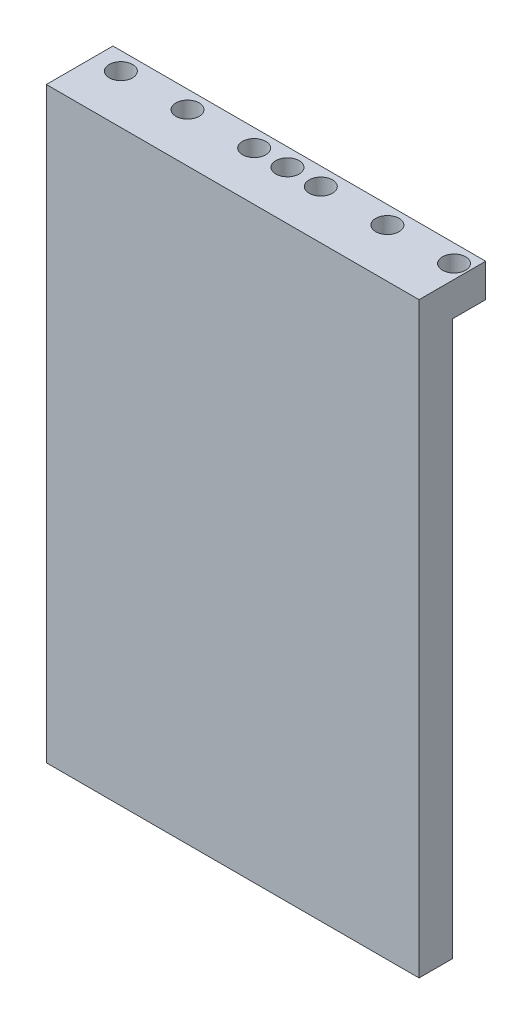
ISO-10303-21;
HEADER;
FILE_DESCRIPTION(('STEP AP214'),'2;1');
FILE_NAME('part.step','',(''),(''),'','','');
FILE_SCHEMA(('AUTOMOTIVE_DESIGN { 1 0 10303 214 1 1 1 1 }'));
ENDSEC;
DATA;
#1=APPLICATION_CONTEXT('core data for automotive mechanical design processes');
#2=APPLICATION_PROTOCOL_DEFINITION('international standard','automotive_design',2000,#1);
#3=PRODUCT_CONTEXT('',#1,'mechanical');
#4=PRODUCT('Part','Part','',(#3));
#5=PRODUCT_RELATED_PRODUCT_CATEGORY('part','',(#4));
#6=PRODUCT_DEFINITION_FORMATION('','',#4);
#7=PRODUCT_DEFINITION_CONTEXT('part definition',#1,'design');
#8=PRODUCT_DEFINITION('design','',#6,#7);
#9=PRODUCT_DEFINITION_SHAPE('','',#8);
#10=(LENGTH_UNIT() NAMED_UNIT(*) SI_UNIT(.MILLI.,.METRE.));
#11=(NAMED_UNIT(*) PLANE_ANGLE_UNIT() SI_UNIT($,.RADIAN.));
#12=(NAMED_UNIT(*) SI_UNIT($,.STERADIAN.) SOLID_ANGLE_UNIT());
#13=UNCERTAINTY_MEASURE_WITH_UNIT(LENGTH_MEASURE(1.E-05),#10,'distance_accuracy_value','');
#14=(GEOMETRIC_REPRESENTATION_CONTEXT(3) GLOBAL_UNCERTAINTY_ASSIGNED_CONTEXT((#13)) GLOBAL_UNIT_ASSIGNED_CONTEXT((#10,
#11,#12)) REPRESENTATION_CONTEXT('',''));
#15=CARTESIAN_POINT('',(0.,0.,0.));
#16=DIRECTION('',(0.,0.,1.));
#17=DIRECTION('',(1.,0.,0.));
#18=AXIS2_PLACEMENT_3D('',#15,#16,#17);
#19=CARTESIAN_POINT('',(0.,0.,0.));
#20=DIRECTION('',(0.,0.,-1.));
#21=DIRECTION('',(-1.,0.,0.));
#22=AXIS2_PLACEMENT_3D('',#19,#20,#21);
#23=PLANE('',#22);
#24=DIRECTION('',(0.,-1.,0.));
#25=VECTOR('',#24,1.);
#26=CARTESIAN_POINT('',(-55.9365891687745,-88.1594123557742,0.));
#27=LINE('',#26,#25);
#28=CARTESIAN_POINT('',(-55.9365891687745,78.1594123557742,0.));
#29=VERTEX_POINT('',#28);
#30=CARTESIAN_POINT('',(-55.9365891687745,-88.1594123557742,0.));
#31=VERTEX_POINT('',#30);
#32=EDGE_CURVE('E143',#29,#31,#27,.T.);
#33=ORIENTED_EDGE('',*,*,#32,.F.);
#34=DIRECTION('',(1.,0.,0.));
#35=VECTOR('',#34,1.);
#36=CARTESIAN_POINT('',(55.9365891687745,78.1594123557742,0.));
#37=LINE('',#36,#35);
#38=CARTESIAN_POINT('',(55.9365891687745,78.1594123557742,0.));
#39=VERTEX_POINT('',#38);
#40=EDGE_CURVE('E124',#29,#39,#37,.T.);
#41=ORIENTED_EDGE('',*,*,#40,.T.);
#42=DIRECTION('',(0.,1.,0.));
#43=VECTOR('',#42,1.);
#44=CARTESIAN_POINT('',(55.9365891687745,-88.1594123557742,0.));
#45=LINE('',#44,#43);
#46=CARTESIAN_POINT('',(55.9365891687745,-88.1594123557742,0.));
#47=VERTEX_POINT('',#46);
#48=EDGE_CURVE('E133',#47,#39,#45,.T.);
#49=ORIENTED_EDGE('',*,*,#48,.F.);
#50=DIRECTION('',(1.,0.,0.));
#51=VECTOR('',#50,1.);
#52=CARTESIAN_POINT('',(55.9365891687745,-88.1594123557742,0.));
#53=LINE('',#52,#51);
#54=EDGE_CURVE('E91',#31,#47,#53,.T.);
#55=ORIENTED_EDGE('',*,*,#54,.F.);
#56=EDGE_LOOP('',(#33,#41,#49,#55));
#57=FACE_BOUND('',#56,.T.);
#58=ADVANCED_FACE('F51',(#57),#23,.T.);
#59=CARTESIAN_POINT('',(55.9365891687745,88.1594123557742,10.));
#60=DIRECTION('',(0.,-1.,0.));
#61=DIRECTION('',(0.,0.,-1.));
#62=AXIS2_PLACEMENT_3D('',#59,#60,#61);
#63=PLANE('',#62);
#64=CARTESIAN_POINT('',(-48.2086840980566,88.1594123557742,-4.65446680339831));
#65=DIRECTION('',(0.,1.,0.));
#66=DIRECTION('',(0.,0.,1.));
#67=AXIS2_PLACEMENT_3D('',#64,#65,#66);
#68=CIRCLE('',#67,3.5);
#69=CARTESIAN_POINT('',(-48.2086840980566,88.1594123557742,-1.15446680339831));
#70=VERTEX_POINT('',#69);
#71=EDGE_CURVE('E315',#70,#70,#68,.T.);
#72=ORIENTED_EDGE('',*,*,#71,.F.);
#73=EDGE_LOOP('',(#72));
#74=FACE_BOUND('',#73,.T.);
#75=CARTESIAN_POINT('',(51.7913159019434,88.1594123557742,-4.65446680339817));
#76=DIRECTION('',(0.,1.,0.));
#77=DIRECTION('',(0.,0.,1.));
#78=AXIS2_PLACEMENT_3D('',#75,#76,#77);
#79=CIRCLE('',#78,3.5);
#80=CARTESIAN_POINT('',(51.7913159019434,88.1594123557742,-1.15446680339817));
#81=VERTEX_POINT('',#80);
#82=EDGE_CURVE('E316',#81,#81,#79,.T.);
#83=ORIENTED_EDGE('',*,*,#82,.F.);
#84=EDGE_LOOP('',(#83));
#85=FACE_BOUND('',#84,.T.);
#86=CARTESIAN_POINT('',(31.7913159019434,88.1594123557742,-4.65446680339817));
#87=DIRECTION('',(0.,1.,0.));
#88=DIRECTION('',(0.,0.,1.));
#89=AXIS2_PLACEMENT_3D('',#86,#87,#88);
#90=CIRCLE('',#89,3.5);
#91=CARTESIAN_POINT('',(31.7913159019434,88.1594123557742,-1.15446680339817));
#92=VERTEX_POINT('',#91);
#93=EDGE_CURVE('E329',#92,#92,#90,.T.);
#94=ORIENTED_EDGE('',*,*,#93,.F.);
#95=EDGE_LOOP('',(#94));
#96=FACE_BOUND('',#95,.T.);
#97=CARTESIAN_POINT('',(-28.2086840980566,88.1594123557742,-4.65446680339831));
#98=DIRECTION('',(0.,1.,0.));
#99=DIRECTION('',(0.,0.,1.));
#100=AXIS2_PLACEMENT_3D('',#97,#98,#99);
#101=CIRCLE('',#100,3.5);
#102=CARTESIAN_POINT('',(-28.2086840980566,88.1594123557742,-1.15446680339831));
#103=VERTEX_POINT('',#102);
#104=EDGE_CURVE('E332',#103,#103,#101,.T.);
#105=ORIENTED_EDGE('',*,*,#104,.F.);
#106=EDGE_LOOP('',(#105));
#107=FACE_BOUND('',#106,.T.);
#108=CARTESIAN_POINT('',(11.7913159019434,88.1594123557742,-4.65446680339817));
#109=DIRECTION('',(0.,-1.,0.));
#110=DIRECTION('',(0.,0.,-1.));
#111=AXIS2_PLACEMENT_3D('',#108,#109,#110);
#112=CIRCLE('',#111,3.5);
#113=CARTESIAN_POINT('',(11.7913159019434,88.1594123557742,-8.15446680339817));
#114=VERTEX_POINT('',#113);
#115=EDGE_CURVE('E135',#114,#114,#112,.T.);
#116=ORIENTED_EDGE('',*,*,#115,.T.);
#117=EDGE_LOOP('',(#116));
#118=FACE_BOUND('',#117,.T.);
#119=CARTESIAN_POINT('',(1.79131590194342,88.1594123557742,-4.65446680339824));
#120=DIRECTION('',(0.,-1.,0.));
#121=DIRECTION('',(0.,0.,-1.));
#122=AXIS2_PLACEMENT_3D('',#119,#120,#121);
#123=CIRCLE('',#122,3.5);
#124=CARTESIAN_POINT('',(1.79131590194342,88.1594123557742,-8.15446680339824));
#125=VERTEX_POINT('',#124);
#126=EDGE_CURVE('E345',#125,#125,#123,.T.);
#127=ORIENTED_EDGE('',*,*,#126,.T.);
#128=EDGE_LOOP('',(#127));
#129=FACE_BOUND('',#128,.T.);
#130=CARTESIAN_POINT('',(-8.20868409805658,88.1594123557742,-4.65446680339831));
#131=DIRECTION('',(0.,-1.,0.));
#132=DIRECTION('',(0.,0.,-1.));
#133=AXIS2_PLACEMENT_3D('',#130,#131,#132);
#134=CIRCLE('',#133,3.5);
#135=CARTESIAN_POINT('',(-8.20868409805658,88.1594123557742,-8.15446680339831));
#136=VERTEX_POINT('',#135);
#137=EDGE_CURVE('E138',#136,#136,#134,.T.);
#138=ORIENTED_EDGE('',*,*,#137,.T.);
#139=EDGE_LOOP('',(#138));
#140=FACE_BOUND('',#139,.T.);
#141=DIRECTION('',(0.,0.,-1.));
#142=VECTOR('',#141,1.);
#143=CARTESIAN_POINT('',(55.9365891687745,88.1594123557742,10.));
#144=LINE('',#143,#142);
#145=CARTESIAN_POINT('',(55.9365891687745,88.1594123557742,10.));
#146=VERTEX_POINT('',#145);
#147=CARTESIAN_POINT('',(55.9365891687745,88.1594123557742,-10.));
#148=VERTEX_POINT('',#147);
#149=EDGE_CURVE('E151',#146,#148,#144,.T.);
#150=ORIENTED_EDGE('',*,*,#149,.T.);
#151=DIRECTION('',(-1.,0.,0.));
#152=VECTOR('',#151,1.);
#153=CARTESIAN_POINT('',(55.9365891687745,88.1594123557742,-10.));
#154=LINE('',#153,#152);
#155=CARTESIAN_POINT('',(-55.9365891687745,88.1594123557742,-10.));
#156=VERTEX_POINT('',#155);
#157=EDGE_CURVE('E121',#148,#156,#154,.T.);
#158=ORIENTED_EDGE('',*,*,#157,.T.);
#159=DIRECTION('',(0.,0.,-1.));
#160=VECTOR('',#159,1.);
#161=CARTESIAN_POINT('',(-55.9365891687745,88.1594123557742,10.));
#162=LINE('',#161,#160);
#163=CARTESIAN_POINT('',(-55.9365891687745,88.1594123557742,10.));
#164=VERTEX_POINT('',#163);
#165=EDGE_CURVE('E13',#164,#156,#162,.T.);
#166=ORIENTED_EDGE('',*,*,#165,.F.);
#167=DIRECTION('',(-1.,0.,0.));
#168=VECTOR('',#167,1.);
#169=CARTESIAN_POINT('',(55.9365891687745,88.1594123557742,10.));
#170=LINE('',#169,#168);
#171=EDGE_CURVE('E145',#146,#164,#170,.T.);
#172=ORIENTED_EDGE('',*,*,#171,.F.);
#173=EDGE_LOOP('',(#150,#158,#166,#172));
#174=FACE_BOUND('',#173,.T.);
#175=ADVANCED_FACE('F53',(#74,#85,#96,#107,#118,#129,#140,#174),#63,.F.);
#176=CARTESIAN_POINT('',(-55.9365891687745,-88.1594123557742,10.));
#177=DIRECTION('',(1.,0.,0.));
#178=DIRECTION('',(0.,0.,-1.));
#179=AXIS2_PLACEMENT_3D('',#176,#177,#178);
#180=PLANE('',#179);
#181=ORIENTED_EDGE('',*,*,#165,.T.);
#182=DIRECTION('',(0.,1.,0.));
#183=VECTOR('',#182,1.);
#184=CARTESIAN_POINT('',(-55.9365891687745,78.1594123557742,-10.));
#185=LINE('',#184,#183);
#186=CARTESIAN_POINT('',(-55.9365891687745,78.1594123557742,-10.));
#187=VERTEX_POINT('',#186);
#188=EDGE_CURVE('E123',#187,#156,#185,.T.);
#189=ORIENTED_EDGE('',*,*,#188,.F.);
#190=DIRECTION('',(0.,0.,1.));
#191=VECTOR('',#190,1.);
#192=CARTESIAN_POINT('',(-55.9365891687745,78.1594123557742,-10.));
#193=LINE('',#192,#191);
#194=EDGE_CURVE('E128',#187,#29,#193,.T.);
#195=ORIENTED_EDGE('',*,*,#194,.T.);
#196=ORIENTED_EDGE('',*,*,#32,.T.);
#197=DIRECTION('',(0.,0.,-1.));
#198=VECTOR('',#197,1.);
#199=CARTESIAN_POINT('',(-55.9365891687745,-88.1594123557742,10.));
#200=LINE('',#199,#198);
#201=CARTESIAN_POINT('',(-55.9365891687745,-88.1594123557742,10.));
#202=VERTEX_POINT('',#201);
#203=EDGE_CURVE('E59',#202,#31,#200,.T.);
#204=ORIENTED_EDGE('',*,*,#203,.F.);
#205=DIRECTION('',(0.,-1.,0.));
#206=VECTOR('',#205,1.);
#207=CARTESIAN_POINT('',(-55.9365891687745,-88.1594123557742,10.));
#208=LINE('',#207,#206);
#209=EDGE_CURVE('E98',#164,#202,#208,.T.);
#210=ORIENTED_EDGE('',*,*,#209,.F.);
#211=EDGE_LOOP('',(#181,#189,#195,#196,#204,#210));
#212=FACE_BOUND('',#211,.T.);
#213=ADVANCED_FACE('F161',(#212),#180,.F.);
#214=CARTESIAN_POINT('',(55.9365891687745,-88.1594123557742,10.));
#215=DIRECTION('',(0.,1.,0.));
#216=DIRECTION('',(0.,0.,1.));
#217=AXIS2_PLACEMENT_3D('',#214,#215,#216);
#218=PLANE('',#217);
#219=ORIENTED_EDGE('',*,*,#54,.T.);
#220=DIRECTION('',(0.,0.,-1.));
#221=VECTOR('',#220,1.);
#222=CARTESIAN_POINT('',(55.9365891687745,-88.1594123557742,10.));
#223=LINE('',#222,#221);
#224=CARTESIAN_POINT('',(55.9365891687745,-88.1594123557742,10.));
#225=VERTEX_POINT('',#224);
#226=EDGE_CURVE('E156',#225,#47,#223,.T.);
#227=ORIENTED_EDGE('',*,*,#226,.F.);
#228=DIRECTION('',(1.,0.,0.));
#229=VECTOR('',#228,1.);
#230=CARTESIAN_POINT('',(55.9365891687745,-88.1594123557742,10.));
#231=LINE('',#230,#229);
#232=EDGE_CURVE('E148',#202,#225,#231,.T.);
#233=ORIENTED_EDGE('',*,*,#232,.F.);
#234=ORIENTED_EDGE('',*,*,#203,.T.);
#235=EDGE_LOOP('',(#219,#227,#233,#234));
#236=FACE_BOUND('',#235,.T.);
#237=ADVANCED_FACE('F158',(#236),#218,.F.);
#238=CARTESIAN_POINT('',(55.9365891687745,-88.1594123557742,10.));
#239=DIRECTION('',(-1.,0.,0.));
#240=DIRECTION('',(0.,0.,1.));
#241=AXIS2_PLACEMENT_3D('',#238,#239,#240);
#242=PLANE('',#241);
#243=ORIENTED_EDGE('',*,*,#48,.T.);
#244=DIRECTION('',(0.,0.,-1.));
#245=VECTOR('',#244,1.);
#246=CARTESIAN_POINT('',(55.9365891687745,78.1594123557742,-10.));
#247=LINE('',#246,#245);
#248=CARTESIAN_POINT('',(55.9365891687745,78.1594123557742,-10.));
#249=VERTEX_POINT('',#248);
#250=EDGE_CURVE('E66',#39,#249,#247,.T.);
#251=ORIENTED_EDGE('',*,*,#250,.T.);
#252=DIRECTION('',(0.,1.,0.));
#253=VECTOR('',#252,1.);
#254=CARTESIAN_POINT('',(55.9365891687745,78.1594123557742,-10.));
#255=LINE('',#254,#253);
#256=EDGE_CURVE('E116',#249,#148,#255,.T.);
#257=ORIENTED_EDGE('',*,*,#256,.T.);
#258=ORIENTED_EDGE('',*,*,#149,.F.);
#259=DIRECTION('',(0.,1.,0.));
#260=VECTOR('',#259,1.);
#261=CARTESIAN_POINT('',(55.9365891687745,-88.1594123557742,10.));
#262=LINE('',#261,#260);
#263=EDGE_CURVE('E75',#225,#146,#262,.T.);
#264=ORIENTED_EDGE('',*,*,#263,.F.);
#265=ORIENTED_EDGE('',*,*,#226,.T.);
#266=EDGE_LOOP('',(#243,#251,#257,#258,#264,#265));
#267=FACE_BOUND('',#266,.T.);
#268=ADVANCED_FACE('F131',(#267),#242,.F.);
#269=CARTESIAN_POINT('',(0.,0.,10.));
#270=DIRECTION('',(0.,0.,-1.));
#271=DIRECTION('',(-1.,0.,0.));
#272=AXIS2_PLACEMENT_3D('',#269,#270,#271);
#273=PLANE('',#272);
#274=ORIENTED_EDGE('',*,*,#171,.T.);
#275=ORIENTED_EDGE('',*,*,#209,.T.);
#276=ORIENTED_EDGE('',*,*,#232,.T.);
#277=ORIENTED_EDGE('',*,*,#263,.T.);
#278=EDGE_LOOP('',(#274,#275,#276,#277));
#279=FACE_BOUND('',#278,.T.);
#280=ADVANCED_FACE('F165',(#279),#273,.F.);
#281=CARTESIAN_POINT('',(55.9365891687745,78.1594123557742,-10.));
#282=DIRECTION('',(0.,0.,-1.));
#283=DIRECTION('',(-1.,0.,0.));
#284=AXIS2_PLACEMENT_3D('',#281,#282,#283);
#285=PLANE('',#284);
#286=ORIENTED_EDGE('',*,*,#157,.F.);
#287=ORIENTED_EDGE('',*,*,#256,.F.);
#288=DIRECTION('',(-1.,0.,0.));
#289=VECTOR('',#288,1.);
#290=CARTESIAN_POINT('',(55.9365891687745,78.1594123557742,-10.));
#291=LINE('',#290,#289);
#292=EDGE_CURVE('E119',#249,#187,#291,.T.);
#293=ORIENTED_EDGE('',*,*,#292,.T.);
#294=ORIENTED_EDGE('',*,*,#188,.T.);
#295=EDGE_LOOP('',(#286,#287,#293,#294));
#296=FACE_BOUND('',#295,.T.);
#297=ADVANCED_FACE('F117',(#296),#285,.T.);
#298=CARTESIAN_POINT('',(0.,78.1594123557742,0.));
#299=DIRECTION('',(0.,-1.,0.));
#300=DIRECTION('',(0.,0.,-1.));
#301=AXIS2_PLACEMENT_3D('',#298,#299,#300);
#302=PLANE('',#301);
#303=CARTESIAN_POINT('',(-48.2086840980566,78.1594123557742,-4.65446680339831));
#304=DIRECTION('',(0.,1.,0.));
#305=DIRECTION('',(0.,0.,1.));
#306=AXIS2_PLACEMENT_3D('',#303,#304,#305);
#307=CIRCLE('',#306,3.5);
#308=CARTESIAN_POINT('',(-48.2086840980566,78.1594123557742,-1.15446680339831));
#309=VERTEX_POINT('',#308);
#310=EDGE_CURVE('E312',#309,#309,#307,.T.);
#311=ORIENTED_EDGE('',*,*,#310,.T.);
#312=EDGE_LOOP('',(#311));
#313=FACE_BOUND('',#312,.T.);
#314=CARTESIAN_POINT('',(51.7913159019434,78.1594123557742,-4.65446680339817));
#315=DIRECTION('',(0.,1.,0.));
#316=DIRECTION('',(0.,0.,1.));
#317=AXIS2_PLACEMENT_3D('',#314,#315,#316);
#318=CIRCLE('',#317,3.5);
#319=CARTESIAN_POINT('',(51.7913159019434,78.1594123557742,-1.15446680339817));
#320=VERTEX_POINT('',#319);
#321=EDGE_CURVE('E321',#320,#320,#318,.T.);
#322=ORIENTED_EDGE('',*,*,#321,.T.);
#323=EDGE_LOOP('',(#322));
#324=FACE_BOUND('',#323,.T.);
#325=CARTESIAN_POINT('',(31.7913159019434,78.1594123557742,-4.65446680339817));
#326=DIRECTION('',(0.,1.,0.));
#327=DIRECTION('',(0.,0.,1.));
#328=AXIS2_PLACEMENT_3D('',#325,#326,#327);
#329=CIRCLE('',#328,3.5);
#330=CARTESIAN_POINT('',(31.7913159019434,78.1594123557742,-1.15446680339817));
#331=VERTEX_POINT('',#330);
#332=EDGE_CURVE('E326',#331,#331,#329,.T.);
#333=ORIENTED_EDGE('',*,*,#332,.T.);
#334=EDGE_LOOP('',(#333));
#335=FACE_BOUND('',#334,.T.);
#336=CARTESIAN_POINT('',(-28.2086840980566,78.1594123557742,-4.65446680339831));
#337=DIRECTION('',(0.,1.,0.));
#338=DIRECTION('',(0.,0.,1.));
#339=AXIS2_PLACEMENT_3D('',#336,#337,#338);
#340=CIRCLE('',#339,3.5);
#341=CARTESIAN_POINT('',(-28.2086840980566,78.1594123557742,-1.15446680339831));
#342=VERTEX_POINT('',#341);
#343=EDGE_CURVE('E318',#342,#342,#340,.T.);
#344=ORIENTED_EDGE('',*,*,#343,.T.);
#345=EDGE_LOOP('',(#344));
#346=FACE_BOUND('',#345,.T.);
#347=CARTESIAN_POINT('',(11.7913159019434,78.1594123557742,-4.65446680339817));
#348=DIRECTION('',(0.,-1.,0.));
#349=DIRECTION('',(0.,0.,-1.));
#350=AXIS2_PLACEMENT_3D('',#347,#348,#349);
#351=CIRCLE('',#350,3.5);
#352=CARTESIAN_POINT('',(11.7913159019434,78.1594123557742,-8.15446680339817));
#353=VERTEX_POINT('',#352);
#354=EDGE_CURVE('E339',#353,#353,#351,.T.);
#355=ORIENTED_EDGE('',*,*,#354,.F.);
#356=EDGE_LOOP('',(#355));
#357=FACE_BOUND('',#356,.T.);
#358=CARTESIAN_POINT('',(1.79131590194342,78.1594123557742,-4.65446680339824));
#359=DIRECTION('',(0.,-1.,0.));
#360=DIRECTION('',(0.,0.,-1.));
#361=AXIS2_PLACEMENT_3D('',#358,#359,#360);
#362=CIRCLE('',#361,3.5);
#363=CARTESIAN_POINT('',(1.79131590194342,78.1594123557742,-8.15446680339824));
#364=VERTEX_POINT('',#363);
#365=EDGE_CURVE('E342',#364,#364,#362,.T.);
#366=ORIENTED_EDGE('',*,*,#365,.F.);
#367=EDGE_LOOP('',(#366));
#368=FACE_BOUND('',#367,.T.);
#369=CARTESIAN_POINT('',(-8.20868409805658,78.1594123557742,-4.65446680339831));
#370=DIRECTION('',(0.,-1.,0.));
#371=DIRECTION('',(0.,0.,-1.));
#372=AXIS2_PLACEMENT_3D('',#369,#370,#371);
#373=CIRCLE('',#372,3.5);
#374=CARTESIAN_POINT('',(-8.20868409805658,78.1594123557742,-8.15446680339831));
#375=VERTEX_POINT('',#374);
#376=EDGE_CURVE('E347',#375,#375,#373,.T.);
#377=ORIENTED_EDGE('',*,*,#376,.F.);
#378=EDGE_LOOP('',(#377));
#379=FACE_BOUND('',#378,.T.);
#380=ORIENTED_EDGE('',*,*,#250,.F.);
#381=ORIENTED_EDGE('',*,*,#40,.F.);
#382=ORIENTED_EDGE('',*,*,#194,.F.);
#383=ORIENTED_EDGE('',*,*,#292,.F.);
#384=EDGE_LOOP('',(#380,#381,#382,#383));
#385=FACE_BOUND('',#384,.T.);
#386=ADVANCED_FACE('F127',(#313,#324,#335,#346,#357,#368,#379,#385),#302,.T.);
#387=CARTESIAN_POINT('',(-8.20868409805658,88.1594123557742,-4.65446680339831));
#388=DIRECTION('',(0.,-1.,0.));
#389=DIRECTION('',(0.,0.,-1.));
#390=AXIS2_PLACEMENT_3D('',#387,#388,#389);
#391=CYLINDRICAL_SURFACE('',#390,3.5);
#392=ORIENTED_EDGE('',*,*,#137,.F.);
#393=EDGE_LOOP('',(#392));
#394=FACE_BOUND('',#393,.T.);
#395=ORIENTED_EDGE('',*,*,#376,.T.);
#396=EDGE_LOOP('',(#395));
#397=FACE_BOUND('',#396,.T.);
#398=ADVANCED_FACE('F201',(#394,#397),#391,.F.);
#399=CARTESIAN_POINT('',(1.79131590194342,88.1594123557742,-4.65446680339824));
#400=DIRECTION('',(0.,-1.,0.));
#401=DIRECTION('',(0.,0.,-1.));
#402=AXIS2_PLACEMENT_3D('',#399,#400,#401);
#403=CYLINDRICAL_SURFACE('',#402,3.5);
#404=ORIENTED_EDGE('',*,*,#126,.F.);
#405=EDGE_LOOP('',(#404));
#406=FACE_BOUND('',#405,.T.);
#407=ORIENTED_EDGE('',*,*,#365,.T.);
#408=EDGE_LOOP('',(#407));
#409=FACE_BOUND('',#408,.T.);
#410=ADVANCED_FACE('F205',(#406,#409),#403,.F.);
#411=CARTESIAN_POINT('',(11.7913159019434,88.1594123557742,-4.65446680339817));
#412=DIRECTION('',(0.,-1.,0.));
#413=DIRECTION('',(0.,0.,-1.));
#414=AXIS2_PLACEMENT_3D('',#411,#412,#413);
#415=CYLINDRICAL_SURFACE('',#414,3.5);
#416=ORIENTED_EDGE('',*,*,#115,.F.);
#417=EDGE_LOOP('',(#416));
#418=FACE_BOUND('',#417,.T.);
#419=ORIENTED_EDGE('',*,*,#354,.T.);
#420=EDGE_LOOP('',(#419));
#421=FACE_BOUND('',#420,.T.);
#422=ADVANCED_FACE('F214',(#418,#421),#415,.F.);
#423=CARTESIAN_POINT('',(-28.2086840980566,78.1594123557742,-4.65446680339831));
#424=DIRECTION('',(0.,1.,0.));
#425=DIRECTION('',(0.,0.,1.));
#426=AXIS2_PLACEMENT_3D('',#423,#424,#425);
#427=CYLINDRICAL_SURFACE('',#426,3.5);
#428=ORIENTED_EDGE('',*,*,#343,.F.);
#429=EDGE_LOOP('',(#428));
#430=FACE_BOUND('',#429,.T.);
#431=ORIENTED_EDGE('',*,*,#104,.T.);
#432=EDGE_LOOP('',(#431));
#433=FACE_BOUND('',#432,.T.);
#434=ADVANCED_FACE('F223',(#430,#433),#427,.F.);
#435=CARTESIAN_POINT('',(31.7913159019434,78.1594123557742,-4.65446680339817));
#436=DIRECTION('',(0.,1.,0.));
#437=DIRECTION('',(0.,0.,1.));
#438=AXIS2_PLACEMENT_3D('',#435,#436,#437);
#439=CYLINDRICAL_SURFACE('',#438,3.5);
#440=ORIENTED_EDGE('',*,*,#332,.F.);
#441=EDGE_LOOP('',(#440));
#442=FACE_BOUND('',#441,.T.);
#443=ORIENTED_EDGE('',*,*,#93,.T.);
#444=EDGE_LOOP('',(#443));
#445=FACE_BOUND('',#444,.T.);
#446=ADVANCED_FACE('F232',(#442,#445),#439,.F.);
#447=CARTESIAN_POINT('',(51.7913159019434,78.1594123557742,-4.65446680339817));
#448=DIRECTION('',(0.,1.,0.));
#449=DIRECTION('',(0.,0.,1.));
#450=AXIS2_PLACEMENT_3D('',#447,#448,#449);
#451=CYLINDRICAL_SURFACE('',#450,3.5);
#452=ORIENTED_EDGE('',*,*,#321,.F.);
#453=EDGE_LOOP('',(#452));
#454=FACE_BOUND('',#453,.T.);
#455=ORIENTED_EDGE('',*,*,#82,.T.);
#456=EDGE_LOOP('',(#455));
#457=FACE_BOUND('',#456,.T.);
#458=ADVANCED_FACE('F240',(#454,#457),#451,.F.);
#459=CARTESIAN_POINT('',(-48.2086840980566,78.1594123557742,-4.65446680339831));
#460=DIRECTION('',(0.,1.,0.));
#461=DIRECTION('',(0.,0.,1.));
#462=AXIS2_PLACEMENT_3D('',#459,#460,#461);
#463=CYLINDRICAL_SURFACE('',#462,3.5);
#464=ORIENTED_EDGE('',*,*,#310,.F.);
#465=EDGE_LOOP('',(#464));
#466=FACE_BOUND('',#465,.T.);
#467=ORIENTED_EDGE('',*,*,#71,.T.);
#468=EDGE_LOOP('',(#467));
#469=FACE_BOUND('',#468,.T.);
#470=ADVANCED_FACE('F262',(#466,#469),#463,.F.);
#471=CLOSED_SHELL('',(#58,#175,#213,#237,#268,#280,#297,#386,#398,#410,#422,#434,#446,#458,#470));
#472=MANIFOLD_SOLID_BREP('B2',#471);
#473=ADVANCED_BREP_SHAPE_REPRESENTATION('',(#18,#472),#14);
#474=SHAPE_DEFINITION_REPRESENTATION(#9,#473);
ENDSEC;
END-ISO-10303-21;
